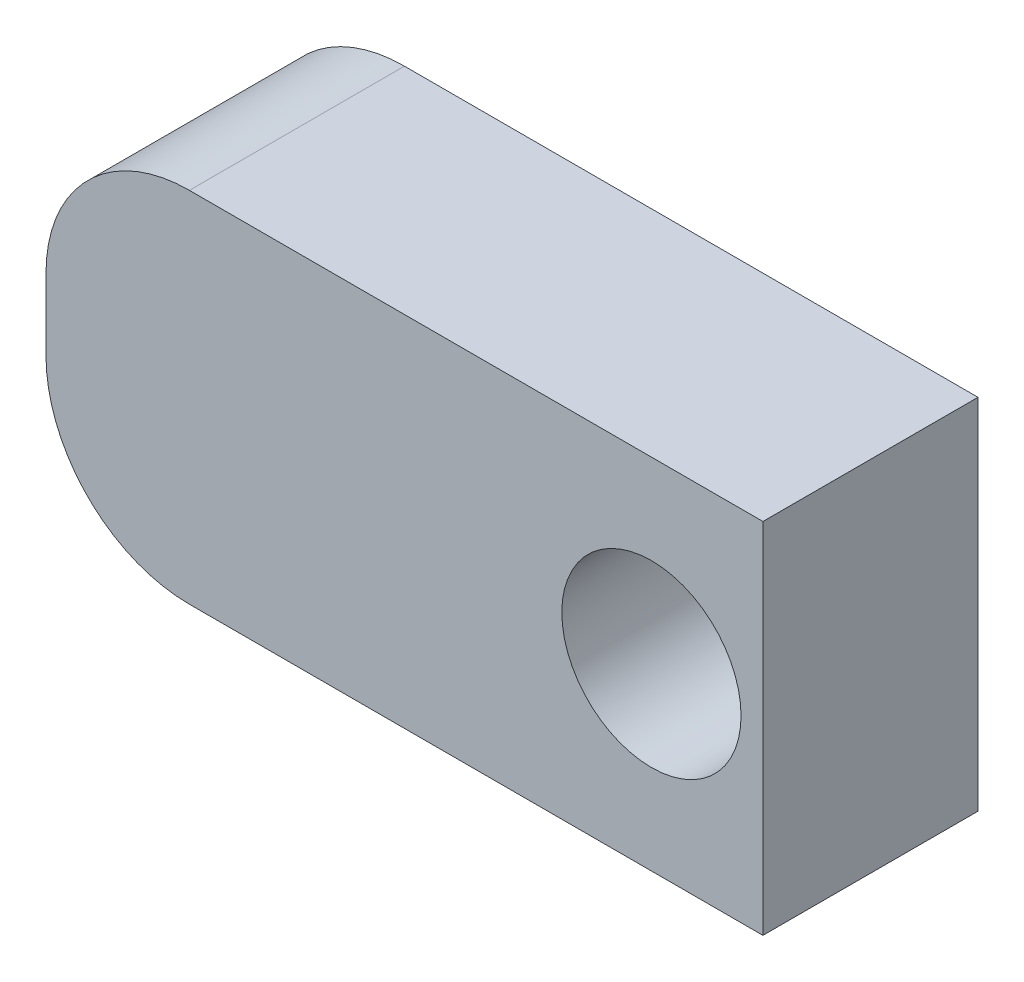
ISO-10303-21;
HEADER;
FILE_DESCRIPTION(('STEP AP214'),'2;1');
FILE_NAME('part.step','',(''),(''),'','','');
FILE_SCHEMA(('AUTOMOTIVE_DESIGN { 1 0 10303 214 1 1 1 1 }'));
ENDSEC;
DATA;
#1=APPLICATION_CONTEXT('core data for automotive mechanical design processes');
#2=APPLICATION_PROTOCOL_DEFINITION('international standard','automotive_design',2000,#1);
#3=PRODUCT_CONTEXT('',#1,'mechanical');
#4=PRODUCT('Part','Part','',(#3));
#5=PRODUCT_RELATED_PRODUCT_CATEGORY('part','',(#4));
#6=PRODUCT_DEFINITION_FORMATION('','',#4);
#7=PRODUCT_DEFINITION_CONTEXT('part definition',#1,'design');
#8=PRODUCT_DEFINITION('design','',#6,#7);
#9=PRODUCT_DEFINITION_SHAPE('','',#8);
#10=(LENGTH_UNIT() NAMED_UNIT(*) SI_UNIT(.MILLI.,.METRE.));
#11=(NAMED_UNIT(*) PLANE_ANGLE_UNIT() SI_UNIT($,.RADIAN.));
#12=(NAMED_UNIT(*) SI_UNIT($,.STERADIAN.) SOLID_ANGLE_UNIT());
#13=UNCERTAINTY_MEASURE_WITH_UNIT(LENGTH_MEASURE(1.E-05),#10,'distance_accuracy_value','');
#14=(GEOMETRIC_REPRESENTATION_CONTEXT(3) GLOBAL_UNCERTAINTY_ASSIGNED_CONTEXT((#13)) GLOBAL_UNIT_ASSIGNED_CONTEXT((#10,
#11,#12)) REPRESENTATION_CONTEXT('',''));
#15=CARTESIAN_POINT('',(0.,0.,0.));
#16=DIRECTION('',(0.,0.,1.));
#17=DIRECTION('',(1.,0.,0.));
#18=AXIS2_PLACEMENT_3D('',#15,#16,#17);
#19=CARTESIAN_POINT('',(-6.,-1.,6.));
#20=DIRECTION('',(0.,0.,1.));
#21=DIRECTION('',(1.,0.,0.));
#22=AXIS2_PLACEMENT_3D('',#19,#20,#21);
#23=PLANE('',#22);
#24=DIRECTION('',(0.,1.,0.));
#25=VECTOR('',#24,1.);
#26=CARTESIAN_POINT('',(10.,5.,6.));
#27=LINE('',#26,#25);
#28=CARTESIAN_POINT('',(10.,-5.,6.));
#29=VERTEX_POINT('',#28);
#30=CARTESIAN_POINT('',(10.,5.,6.));
#31=VERTEX_POINT('',#30);
#32=EDGE_CURVE('E135',#29,#31,#27,.T.);
#33=ORIENTED_EDGE('',*,*,#32,.T.);
#34=DIRECTION('',(-1.,0.,0.));
#35=VECTOR('',#34,1.);
#36=CARTESIAN_POINT('',(-5.99999999999997,5.,6.));
#37=LINE('',#36,#35);
#38=CARTESIAN_POINT('',(-5.99999999999997,5.,6.));
#39=VERTEX_POINT('',#38);
#40=EDGE_CURVE('E93',#31,#39,#37,.T.);
#41=ORIENTED_EDGE('',*,*,#40,.T.);
#42=CARTESIAN_POINT('',(-6.,1.,6.));
#43=DIRECTION('',(0.,0.,1.));
#44=DIRECTION('',(1.,0.,0.));
#45=AXIS2_PLACEMENT_3D('',#42,#43,#44);
#46=CIRCLE('',#45,4.);
#47=CARTESIAN_POINT('',(-10.,0.999999999999971,6.));
#48=VERTEX_POINT('',#47);
#49=EDGE_CURVE('E106',#39,#48,#46,.T.);
#50=ORIENTED_EDGE('',*,*,#49,.T.);
#51=DIRECTION('',(0.,-1.,0.));
#52=VECTOR('',#51,1.);
#53=CARTESIAN_POINT('',(-10.,0.999999999999971,6.));
#54=LINE('',#53,#52);
#55=CARTESIAN_POINT('',(-10.,-0.999999999999972,6.));
#56=VERTEX_POINT('',#55);
#57=EDGE_CURVE('E100',#48,#56,#54,.T.);
#58=ORIENTED_EDGE('',*,*,#57,.T.);
#59=CARTESIAN_POINT('',(-6.,-1.,6.));
#60=DIRECTION('',(0.,0.,1.));
#61=DIRECTION('',(1.,0.,0.));
#62=AXIS2_PLACEMENT_3D('',#59,#60,#61);
#63=CIRCLE('',#62,4.);
#64=CARTESIAN_POINT('',(-5.99999999999997,-5.,6.));
#65=VERTEX_POINT('',#64);
#66=EDGE_CURVE('E104',#56,#65,#63,.T.);
#67=ORIENTED_EDGE('',*,*,#66,.T.);
#68=DIRECTION('',(1.,0.,0.));
#69=VECTOR('',#68,1.);
#70=CARTESIAN_POINT('',(-5.99999999999997,-5.,6.));
#71=LINE('',#70,#69);
#72=EDGE_CURVE('E56',#65,#29,#71,.T.);
#73=ORIENTED_EDGE('',*,*,#72,.T.);
#74=EDGE_LOOP('',(#33,#41,#50,#58,#67,#73));
#75=FACE_BOUND('',#74,.T.);
#76=CARTESIAN_POINT('',(6.88966979393766,0.,6.));
#77=DIRECTION('',(0.,0.,1.));
#78=DIRECTION('',(1.,0.,0.));
#79=AXIS2_PLACEMENT_3D('',#76,#77,#78);
#80=CIRCLE('',#79,2.5);
#81=CARTESIAN_POINT('',(9.38966979393766,0.,6.));
#82=VERTEX_POINT('',#81);
#83=EDGE_CURVE('E128',#82,#82,#80,.T.);
#84=ORIENTED_EDGE('',*,*,#83,.F.);
#85=EDGE_LOOP('',(#84));
#86=FACE_BOUND('',#85,.T.);
#87=ADVANCED_FACE('F39',(#75,#86),#23,.T.);
#88=CARTESIAN_POINT('',(-6.,-1.,0.));
#89=DIRECTION('',(0.,0.,1.));
#90=DIRECTION('',(1.,0.,0.));
#91=AXIS2_PLACEMENT_3D('',#88,#89,#90);
#92=PLANE('',#91);
#93=DIRECTION('',(0.,1.,0.));
#94=VECTOR('',#93,1.);
#95=CARTESIAN_POINT('',(10.,5.,0.));
#96=LINE('',#95,#94);
#97=CARTESIAN_POINT('',(10.,-5.,0.));
#98=VERTEX_POINT('',#97);
#99=CARTESIAN_POINT('',(10.,5.,0.));
#100=VERTEX_POINT('',#99);
#101=EDGE_CURVE('E124',#98,#100,#96,.T.);
#102=ORIENTED_EDGE('',*,*,#101,.F.);
#103=DIRECTION('',(1.,0.,0.));
#104=VECTOR('',#103,1.);
#105=CARTESIAN_POINT('',(-5.99999999999997,-5.,0.));
#106=LINE('',#105,#104);
#107=CARTESIAN_POINT('',(-5.99999999999997,-5.,0.));
#108=VERTEX_POINT('',#107);
#109=EDGE_CURVE('E85',#108,#98,#106,.T.);
#110=ORIENTED_EDGE('',*,*,#109,.F.);
#111=CARTESIAN_POINT('',(-6.,-1.,0.));
#112=DIRECTION('',(0.,0.,1.));
#113=DIRECTION('',(1.,0.,0.));
#114=AXIS2_PLACEMENT_3D('',#111,#112,#113);
#115=CIRCLE('',#114,4.);
#116=CARTESIAN_POINT('',(-10.,-0.999999999999972,0.));
#117=VERTEX_POINT('',#116);
#118=EDGE_CURVE('E79',#117,#108,#115,.T.);
#119=ORIENTED_EDGE('',*,*,#118,.F.);
#120=DIRECTION('',(0.,-1.,0.));
#121=VECTOR('',#120,1.);
#122=CARTESIAN_POINT('',(-10.,0.999999999999971,0.));
#123=LINE('',#122,#121);
#124=CARTESIAN_POINT('',(-10.,0.999999999999971,0.));
#125=VERTEX_POINT('',#124);
#126=EDGE_CURVE('E114',#125,#117,#123,.T.);
#127=ORIENTED_EDGE('',*,*,#126,.F.);
#128=CARTESIAN_POINT('',(-6.,1.,0.));
#129=DIRECTION('',(0.,0.,1.));
#130=DIRECTION('',(1.,0.,0.));
#131=AXIS2_PLACEMENT_3D('',#128,#129,#130);
#132=CIRCLE('',#131,4.);
#133=CARTESIAN_POINT('',(-5.99999999999997,5.,0.));
#134=VERTEX_POINT('',#133);
#135=EDGE_CURVE('E130',#134,#125,#132,.T.);
#136=ORIENTED_EDGE('',*,*,#135,.F.);
#137=DIRECTION('',(-1.,0.,0.));
#138=VECTOR('',#137,1.);
#139=CARTESIAN_POINT('',(-5.99999999999997,5.,0.));
#140=LINE('',#139,#138);
#141=EDGE_CURVE('E127',#100,#134,#140,.T.);
#142=ORIENTED_EDGE('',*,*,#141,.F.);
#143=EDGE_LOOP('',(#102,#110,#119,#127,#136,#142));
#144=FACE_BOUND('',#143,.T.);
#145=CARTESIAN_POINT('',(6.88966979393766,0.,0.));
#146=DIRECTION('',(0.,0.,1.));
#147=DIRECTION('',(1.,0.,0.));
#148=AXIS2_PLACEMENT_3D('',#145,#146,#147);
#149=CIRCLE('',#148,2.5);
#150=CARTESIAN_POINT('',(9.38966979393766,0.,0.));
#151=VERTEX_POINT('',#150);
#152=EDGE_CURVE('E228',#151,#151,#149,.T.);
#153=ORIENTED_EDGE('',*,*,#152,.T.);
#154=EDGE_LOOP('',(#153));
#155=FACE_BOUND('',#154,.T.);
#156=ADVANCED_FACE('F144',(#144,#155),#92,.F.);
#157=CARTESIAN_POINT('',(10.,5.,6.));
#158=DIRECTION('',(-1.,0.,0.));
#159=DIRECTION('',(0.,-1.,0.));
#160=AXIS2_PLACEMENT_3D('',#157,#158,#159);
#161=PLANE('',#160);
#162=ORIENTED_EDGE('',*,*,#101,.T.);
#163=DIRECTION('',(0.,0.,-1.));
#164=VECTOR('',#163,1.);
#165=CARTESIAN_POINT('',(10.,5.,6.));
#166=LINE('',#165,#164);
#167=EDGE_CURVE('E11',#31,#100,#166,.T.);
#168=ORIENTED_EDGE('',*,*,#167,.F.);
#169=ORIENTED_EDGE('',*,*,#32,.F.);
#170=DIRECTION('',(0.,0.,-1.));
#171=VECTOR('',#170,1.);
#172=CARTESIAN_POINT('',(10.,-5.,6.));
#173=LINE('',#172,#171);
#174=EDGE_CURVE('E120',#29,#98,#173,.T.);
#175=ORIENTED_EDGE('',*,*,#174,.T.);
#176=EDGE_LOOP('',(#162,#168,#169,#175));
#177=FACE_BOUND('',#176,.T.);
#178=ADVANCED_FACE('F41',(#177),#161,.F.);
#179=CARTESIAN_POINT('',(-5.99999999999997,5.,6.));
#180=DIRECTION('',(0.,-1.,0.));
#181=DIRECTION('',(0.,0.,-1.));
#182=AXIS2_PLACEMENT_3D('',#179,#180,#181);
#183=PLANE('',#182);
#184=ORIENTED_EDGE('',*,*,#141,.T.);
#185=DIRECTION('',(0.,0.,-1.));
#186=VECTOR('',#185,1.);
#187=CARTESIAN_POINT('',(-5.99999999999997,5.,6.));
#188=LINE('',#187,#186);
#189=EDGE_CURVE('E48',#39,#134,#188,.T.);
#190=ORIENTED_EDGE('',*,*,#189,.F.);
#191=ORIENTED_EDGE('',*,*,#40,.F.);
#192=ORIENTED_EDGE('',*,*,#167,.T.);
#193=EDGE_LOOP('',(#184,#190,#191,#192));
#194=FACE_BOUND('',#193,.T.);
#195=ADVANCED_FACE('F169',(#194),#183,.F.);
#196=CARTESIAN_POINT('',(-6.,1.,6.));
#197=DIRECTION('',(0.,0.,-1.));
#198=DIRECTION('',(-1.,0.,0.));
#199=AXIS2_PLACEMENT_3D('',#196,#197,#198);
#200=CYLINDRICAL_SURFACE('',#199,4.);
#201=ORIENTED_EDGE('',*,*,#135,.T.);
#202=DIRECTION('',(0.,0.,-1.));
#203=VECTOR('',#202,1.);
#204=CARTESIAN_POINT('',(-10.,0.999999999999971,6.));
#205=LINE('',#204,#203);
#206=EDGE_CURVE('E115',#48,#125,#205,.T.);
#207=ORIENTED_EDGE('',*,*,#206,.F.);
#208=ORIENTED_EDGE('',*,*,#49,.F.);
#209=ORIENTED_EDGE('',*,*,#189,.T.);
#210=EDGE_LOOP('',(#201,#207,#208,#209));
#211=FACE_BOUND('',#210,.T.);
#212=ADVANCED_FACE('F141',(#211),#200,.T.);
#213=CARTESIAN_POINT('',(-10.,0.999999999999971,6.));
#214=DIRECTION('',(1.,0.,0.));
#215=DIRECTION('',(0.,0.,-1.));
#216=AXIS2_PLACEMENT_3D('',#213,#214,#215);
#217=PLANE('',#216);
#218=ORIENTED_EDGE('',*,*,#126,.T.);
#219=DIRECTION('',(0.,0.,-1.));
#220=VECTOR('',#219,1.);
#221=CARTESIAN_POINT('',(-10.,-0.999999999999972,6.));
#222=LINE('',#221,#220);
#223=EDGE_CURVE('E111',#56,#117,#222,.T.);
#224=ORIENTED_EDGE('',*,*,#223,.F.);
#225=ORIENTED_EDGE('',*,*,#57,.F.);
#226=ORIENTED_EDGE('',*,*,#206,.T.);
#227=EDGE_LOOP('',(#218,#224,#225,#226));
#228=FACE_BOUND('',#227,.T.);
#229=ADVANCED_FACE('F112',(#228),#217,.F.);
#230=CARTESIAN_POINT('',(-6.,-1.,6.));
#231=DIRECTION('',(0.,0.,-1.));
#232=DIRECTION('',(-1.,0.,0.));
#233=AXIS2_PLACEMENT_3D('',#230,#231,#232);
#234=CYLINDRICAL_SURFACE('',#233,4.);
#235=ORIENTED_EDGE('',*,*,#118,.T.);
#236=DIRECTION('',(0.,0.,-1.));
#237=VECTOR('',#236,1.);
#238=CARTESIAN_POINT('',(-5.99999999999997,-5.,6.));
#239=LINE('',#238,#237);
#240=EDGE_CURVE('E116',#65,#108,#239,.T.);
#241=ORIENTED_EDGE('',*,*,#240,.F.);
#242=ORIENTED_EDGE('',*,*,#66,.F.);
#243=ORIENTED_EDGE('',*,*,#223,.T.);
#244=EDGE_LOOP('',(#235,#241,#242,#243));
#245=FACE_BOUND('',#244,.T.);
#246=ADVANCED_FACE('F118',(#245),#234,.T.);
#247=CARTESIAN_POINT('',(-5.99999999999997,-5.,6.));
#248=DIRECTION('',(0.,1.,0.));
#249=DIRECTION('',(0.,0.,1.));
#250=AXIS2_PLACEMENT_3D('',#247,#248,#249);
#251=PLANE('',#250);
#252=ORIENTED_EDGE('',*,*,#109,.T.);
#253=ORIENTED_EDGE('',*,*,#174,.F.);
#254=ORIENTED_EDGE('',*,*,#72,.F.);
#255=ORIENTED_EDGE('',*,*,#240,.T.);
#256=EDGE_LOOP('',(#252,#253,#254,#255));
#257=FACE_BOUND('',#256,.T.);
#258=ADVANCED_FACE('F149',(#257),#251,.F.);
#259=CARTESIAN_POINT('',(6.88966979393766,0.,6.));
#260=DIRECTION('',(0.,0.,-1.));
#261=DIRECTION('',(-1.,0.,0.));
#262=AXIS2_PLACEMENT_3D('',#259,#260,#261);
#263=CYLINDRICAL_SURFACE('',#262,2.5);
#264=ORIENTED_EDGE('',*,*,#83,.T.);
#265=EDGE_LOOP('',(#264));
#266=FACE_BOUND('',#265,.T.);
#267=ORIENTED_EDGE('',*,*,#152,.F.);
#268=EDGE_LOOP('',(#267));
#269=FACE_BOUND('',#268,.T.);
#270=ADVANCED_FACE('F151',(#266,#269),#263,.F.);
#271=CLOSED_SHELL('',(#87,#156,#178,#195,#212,#229,#246,#258,#270));
#272=MANIFOLD_SOLID_BREP('B2',#271);
#273=ADVANCED_BREP_SHAPE_REPRESENTATION('',(#18,#272),#14);
#274=SHAPE_DEFINITION_REPRESENTATION(#9,#273);
ENDSEC;
END-ISO-10303-21;
